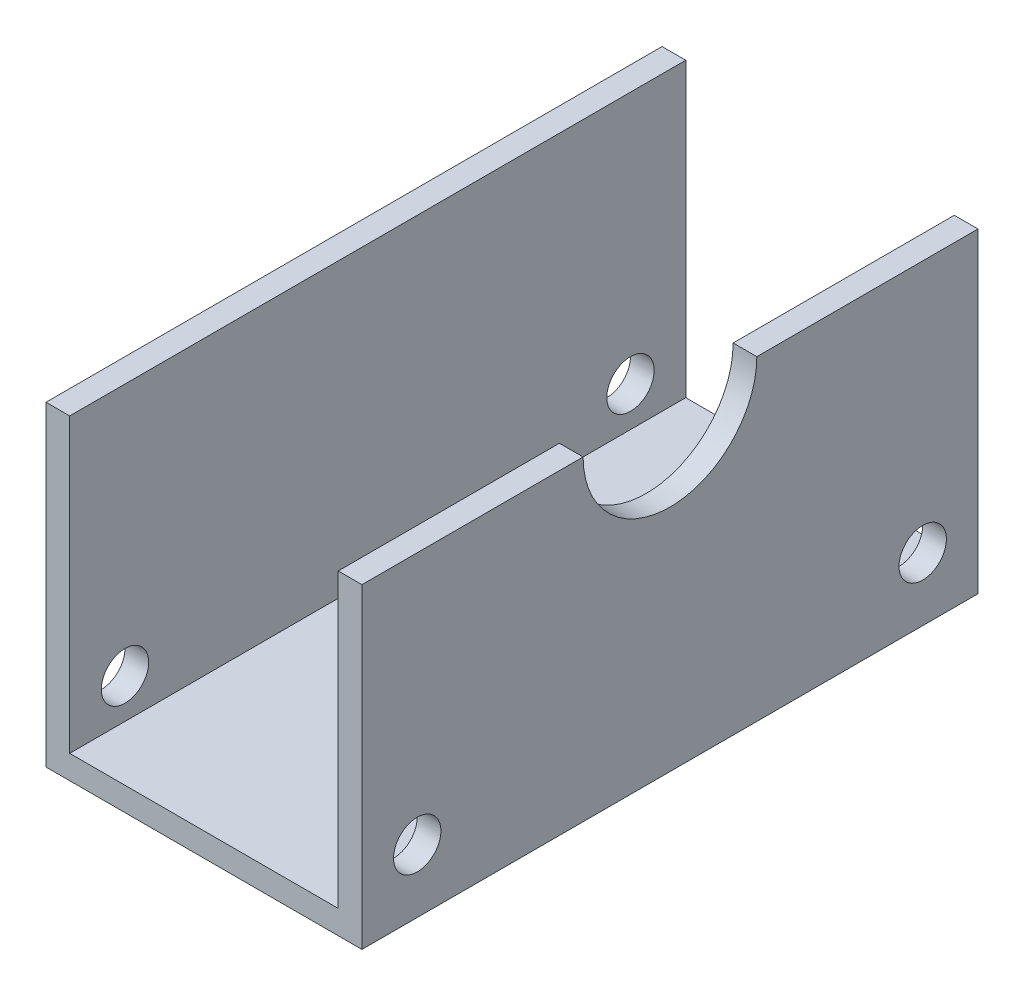
ISO-10303-21;
HEADER;
FILE_DESCRIPTION(('STEP AP214'),'2;1');
FILE_NAME('part.step','',(''),(''),'','','');
FILE_SCHEMA(('AUTOMOTIVE_DESIGN { 1 0 10303 214 1 1 1 1 }'));
ENDSEC;
DATA;
#1=APPLICATION_CONTEXT('core data for automotive mechanical design processes');
#2=APPLICATION_PROTOCOL_DEFINITION('international standard','automotive_design',2000,#1);
#3=PRODUCT_CONTEXT('',#1,'mechanical');
#4=PRODUCT('Part','Part','',(#3));
#5=PRODUCT_RELATED_PRODUCT_CATEGORY('part','',(#4));
#6=PRODUCT_DEFINITION_FORMATION('','',#4);
#7=PRODUCT_DEFINITION_CONTEXT('part definition',#1,'design');
#8=PRODUCT_DEFINITION('design','',#6,#7);
#9=PRODUCT_DEFINITION_SHAPE('','',#8);
#10=(LENGTH_UNIT() NAMED_UNIT(*) SI_UNIT(.MILLI.,.METRE.));
#11=(NAMED_UNIT(*) PLANE_ANGLE_UNIT() SI_UNIT($,.RADIAN.));
#12=(NAMED_UNIT(*) SI_UNIT($,.STERADIAN.) SOLID_ANGLE_UNIT());
#13=UNCERTAINTY_MEASURE_WITH_UNIT(LENGTH_MEASURE(1.E-05),#10,'distance_accuracy_value','');
#14=(GEOMETRIC_REPRESENTATION_CONTEXT(3) GLOBAL_UNCERTAINTY_ASSIGNED_CONTEXT((#13)) GLOBAL_UNIT_ASSIGNED_CONTEXT((#10,
#11,#12)) REPRESENTATION_CONTEXT('',''));
#15=CARTESIAN_POINT('',(0.,0.,0.));
#16=DIRECTION('',(0.,0.,1.));
#17=DIRECTION('',(1.,0.,0.));
#18=AXIS2_PLACEMENT_3D('',#15,#16,#17);
#19=CARTESIAN_POINT('',(3.36373467279582,16.5902105263158,39.));
#20=DIRECTION('',(0.,-1.,0.));
#21=DIRECTION('',(0.,0.,-1.));
#22=AXIS2_PLACEMENT_3D('',#19,#20,#21);
#23=PLANE('',#22);
#24=DIRECTION('',(0.,0.,-1.));
#25=VECTOR('',#24,1.);
#26=CARTESIAN_POINT('',(1.86373467279582,16.5902105263158,39.));
#27=LINE('',#26,#25);
#28=CARTESIAN_POINT('',(1.86373467279582,16.5902105263158,14.));
#29=VERTEX_POINT('',#28);
#30=CARTESIAN_POINT('',(1.86373467279582,16.5902105263158,0.));
#31=VERTEX_POINT('',#30);
#32=EDGE_CURVE('E132',#29,#31,#27,.T.);
#33=ORIENTED_EDGE('',*,*,#32,.F.);
#34=DIRECTION('',(1.,0.,0.));
#35=VECTOR('',#34,1.);
#36=CARTESIAN_POINT('',(-6.63626532720418,16.5902105263158,14.));
#37=LINE('',#36,#35);
#38=CARTESIAN_POINT('',(3.36373467279582,16.5902105263158,14.));
#39=VERTEX_POINT('',#38);
#40=EDGE_CURVE('E48',#29,#39,#37,.T.);
#41=ORIENTED_EDGE('',*,*,#40,.T.);
#42=DIRECTION('',(0.,0.,-1.));
#43=VECTOR('',#42,1.);
#44=CARTESIAN_POINT('',(3.36373467279582,16.5902105263158,39.));
#45=LINE('',#44,#43);
#46=CARTESIAN_POINT('',(3.36373467279582,16.5902105263158,0.));
#47=VERTEX_POINT('',#46);
#48=EDGE_CURVE('E163',#39,#47,#45,.T.);
#49=ORIENTED_EDGE('',*,*,#48,.T.);
#50=DIRECTION('',(-1.,0.,0.));
#51=VECTOR('',#50,1.);
#52=CARTESIAN_POINT('',(3.36373467279582,16.5902105263158,0.));
#53=LINE('',#52,#51);
#54=EDGE_CURVE('E151',#47,#31,#53,.T.);
#55=ORIENTED_EDGE('',*,*,#54,.T.);
#56=EDGE_LOOP('',(#33,#41,#49,#55));
#57=FACE_BOUND('',#56,.T.);
#58=ADVANCED_FACE('F31',(#57),#23,.F.);
#59=CARTESIAN_POINT('',(-15.1362653272042,16.5902105263158,39.));
#60=DIRECTION('',(0.,-1.,0.));
#61=DIRECTION('',(0.,0.,-1.));
#62=AXIS2_PLACEMENT_3D('',#59,#60,#61);
#63=PLANE('',#62);
#64=DIRECTION('',(-1.,0.,0.));
#65=VECTOR('',#64,1.);
#66=CARTESIAN_POINT('',(-15.1362653272042,16.5902105263158,0.));
#67=LINE('',#66,#65);
#68=CARTESIAN_POINT('',(-15.1362653272042,16.5902105263158,0.));
#69=VERTEX_POINT('',#68);
#70=CARTESIAN_POINT('',(-16.6362653272042,16.5902105263158,0.));
#71=VERTEX_POINT('',#70);
#72=EDGE_CURVE('E141',#69,#71,#67,.T.);
#73=ORIENTED_EDGE('',*,*,#72,.T.);
#74=DIRECTION('',(0.,0.,-1.));
#75=VECTOR('',#74,1.);
#76=CARTESIAN_POINT('',(-16.6362653272042,16.5902105263158,39.));
#77=LINE('',#76,#75);
#78=CARTESIAN_POINT('',(-16.6362653272042,16.5902105263158,39.));
#79=VERTEX_POINT('',#78);
#80=EDGE_CURVE('E40',#79,#71,#77,.T.);
#81=ORIENTED_EDGE('',*,*,#80,.F.);
#82=DIRECTION('',(-1.,0.,0.));
#83=VECTOR('',#82,1.);
#84=CARTESIAN_POINT('',(-15.1362653272042,16.5902105263158,39.));
#85=LINE('',#84,#83);
#86=CARTESIAN_POINT('',(-15.1362653272042,16.5902105263158,39.));
#87=VERTEX_POINT('',#86);
#88=EDGE_CURVE('E158',#87,#79,#85,.T.);
#89=ORIENTED_EDGE('',*,*,#88,.F.);
#90=DIRECTION('',(0.,0.,-1.));
#91=VECTOR('',#90,1.);
#92=CARTESIAN_POINT('',(-15.1362653272042,16.5902105263158,39.));
#93=LINE('',#92,#91);
#94=EDGE_CURVE('E137',#87,#69,#93,.T.);
#95=ORIENTED_EDGE('',*,*,#94,.T.);
#96=EDGE_LOOP('',(#73,#81,#89,#95));
#97=FACE_BOUND('',#96,.T.);
#98=ADVANCED_FACE('F33',(#97),#63,.F.);
#99=CARTESIAN_POINT('',(-16.6362653272042,16.5902105263158,39.));
#100=DIRECTION('',(1.,0.,0.));
#101=DIRECTION('',(0.,1.,0.));
#102=AXIS2_PLACEMENT_3D('',#99,#100,#101);
#103=PLANE('',#102);
#104=CARTESIAN_POINT('',(-16.6362653272042,0.590210526315792,35.5));
#105=DIRECTION('',(-1.,0.,0.));
#106=DIRECTION('',(0.,-1.,0.));
#107=AXIS2_PLACEMENT_3D('',#104,#105,#106);
#108=CIRCLE('',#107,1.5);
#109=CARTESIAN_POINT('',(-16.6362653272042,-0.909789473684212,35.5));
#110=VERTEX_POINT('',#109);
#111=EDGE_CURVE('E289',#110,#110,#108,.T.);
#112=ORIENTED_EDGE('',*,*,#111,.F.);
#113=EDGE_LOOP('',(#112));
#114=FACE_BOUND('',#113,.T.);
#115=CARTESIAN_POINT('',(-16.6362653272042,0.590210526315792,3.5));
#116=DIRECTION('',(-1.,0.,0.));
#117=DIRECTION('',(0.,-1.,0.));
#118=AXIS2_PLACEMENT_3D('',#115,#116,#117);
#119=CIRCLE('',#118,1.5);
#120=CARTESIAN_POINT('',(-16.6362653272042,-0.909789473684208,3.5));
#121=VERTEX_POINT('',#120);
#122=EDGE_CURVE('E183',#121,#121,#119,.T.);
#123=ORIENTED_EDGE('',*,*,#122,.F.);
#124=EDGE_LOOP('',(#123));
#125=FACE_BOUND('',#124,.T.);
#126=DIRECTION('',(0.,-1.,0.));
#127=VECTOR('',#126,1.);
#128=CARTESIAN_POINT('',(-16.6362653272042,16.5902105263158,0.));
#129=LINE('',#128,#127);
#130=CARTESIAN_POINT('',(-16.6362653272042,-3.40978947368421,0.));
#131=VERTEX_POINT('',#130);
#132=EDGE_CURVE('E144',#71,#131,#129,.T.);
#133=ORIENTED_EDGE('',*,*,#132,.T.);
#134=DIRECTION('',(0.,0.,-1.));
#135=VECTOR('',#134,1.);
#136=CARTESIAN_POINT('',(-16.6362653272042,-3.40978947368421,39.));
#137=LINE('',#136,#135);
#138=CARTESIAN_POINT('',(-16.6362653272042,-3.40978947368421,39.));
#139=VERTEX_POINT('',#138);
#140=EDGE_CURVE('E170',#139,#131,#137,.T.);
#141=ORIENTED_EDGE('',*,*,#140,.F.);
#142=DIRECTION('',(0.,-1.,0.));
#143=VECTOR('',#142,1.);
#144=CARTESIAN_POINT('',(-16.6362653272042,16.5902105263158,39.));
#145=LINE('',#144,#143);
#146=EDGE_CURVE('E98',#79,#139,#145,.T.);
#147=ORIENTED_EDGE('',*,*,#146,.F.);
#148=ORIENTED_EDGE('',*,*,#80,.T.);
#149=EDGE_LOOP('',(#133,#141,#147,#148));
#150=FACE_BOUND('',#149,.T.);
#151=ADVANCED_FACE('F230',(#114,#125,#150),#103,.F.);
#152=CARTESIAN_POINT('',(-16.6362653272042,-3.40978947368421,39.));
#153=DIRECTION('',(0.,1.,0.));
#154=DIRECTION('',(0.,0.,1.));
#155=AXIS2_PLACEMENT_3D('',#152,#153,#154);
#156=PLANE('',#155);
#157=DIRECTION('',(1.,0.,0.));
#158=VECTOR('',#157,1.);
#159=CARTESIAN_POINT('',(-16.6362653272042,-3.40978947368421,0.));
#160=LINE('',#159,#158);
#161=CARTESIAN_POINT('',(3.36373467279582,-3.40978947368421,0.));
#162=VERTEX_POINT('',#161);
#163=EDGE_CURVE('E146',#131,#162,#160,.T.);
#164=ORIENTED_EDGE('',*,*,#163,.T.);
#165=DIRECTION('',(0.,0.,-1.));
#166=VECTOR('',#165,1.);
#167=CARTESIAN_POINT('',(3.36373467279582,-3.40978947368421,39.));
#168=LINE('',#167,#166);
#169=CARTESIAN_POINT('',(3.36373467279582,-3.40978947368421,39.));
#170=VERTEX_POINT('',#169);
#171=EDGE_CURVE('E167',#170,#162,#168,.T.);
#172=ORIENTED_EDGE('',*,*,#171,.F.);
#173=DIRECTION('',(1.,0.,0.));
#174=VECTOR('',#173,1.);
#175=CARTESIAN_POINT('',(-16.6362653272042,-3.40978947368421,39.));
#176=LINE('',#175,#174);
#177=EDGE_CURVE('E200',#139,#170,#176,.T.);
#178=ORIENTED_EDGE('',*,*,#177,.F.);
#179=ORIENTED_EDGE('',*,*,#140,.T.);
#180=EDGE_LOOP('',(#164,#172,#178,#179));
#181=FACE_BOUND('',#180,.T.);
#182=ADVANCED_FACE('F232',(#181),#156,.F.);
#183=CARTESIAN_POINT('',(3.36373467279582,-3.40978947368421,39.));
#184=DIRECTION('',(-1.,0.,0.));
#185=DIRECTION('',(0.,0.,1.));
#186=AXIS2_PLACEMENT_3D('',#183,#184,#185);
#187=PLANE('',#186);
#188=CARTESIAN_POINT('',(3.36373467279582,0.590210526315798,35.5));
#189=DIRECTION('',(-1.,0.,0.));
#190=DIRECTION('',(0.,-1.,0.));
#191=AXIS2_PLACEMENT_3D('',#188,#189,#190);
#192=CIRCLE('',#191,1.5);
#193=CARTESIAN_POINT('',(3.36373467279582,-0.909789473684205,35.5));
#194=VERTEX_POINT('',#193);
#195=EDGE_CURVE('E285',#194,#194,#192,.T.);
#196=ORIENTED_EDGE('',*,*,#195,.T.);
#197=EDGE_LOOP('',(#196));
#198=FACE_BOUND('',#197,.T.);
#199=CARTESIAN_POINT('',(3.36373467279582,0.590210526315798,3.5));
#200=DIRECTION('',(-1.,0.,0.));
#201=DIRECTION('',(0.,-1.,0.));
#202=AXIS2_PLACEMENT_3D('',#199,#200,#201);
#203=CIRCLE('',#202,1.5);
#204=CARTESIAN_POINT('',(3.36373467279582,-0.909789473684201,3.5));
#205=VERTEX_POINT('',#204);
#206=EDGE_CURVE('E176',#205,#205,#203,.T.);
#207=ORIENTED_EDGE('',*,*,#206,.T.);
#208=EDGE_LOOP('',(#207));
#209=FACE_BOUND('',#208,.T.);
#210=ORIENTED_EDGE('',*,*,#48,.F.);
#211=CARTESIAN_POINT('',(3.36373467279582,16.5902105263158,19.5));
#212=DIRECTION('',(1.,0.,0.));
#213=DIRECTION('',(0.,0.,-1.));
#214=AXIS2_PLACEMENT_3D('',#211,#212,#213);
#215=CIRCLE('',#214,5.5);
#216=CARTESIAN_POINT('',(3.36373467279582,16.5902105263158,25.));
#217=VERTEX_POINT('',#216);
#218=EDGE_CURVE('E180',#217,#39,#215,.T.);
#219=ORIENTED_EDGE('',*,*,#218,.F.);
#220=CARTESIAN_POINT('',(3.36373467279582,16.5902105263158,39.));
#221=VERTEX_POINT('',#220);
#222=EDGE_CURVE('E164',#221,#217,#45,.T.);
#223=ORIENTED_EDGE('',*,*,#222,.F.);
#224=DIRECTION('',(0.,1.,0.));
#225=VECTOR('',#224,1.);
#226=CARTESIAN_POINT('',(3.36373467279582,-3.40978947368421,39.));
#227=LINE('',#226,#225);
#228=EDGE_CURVE('E202',#170,#221,#227,.T.);
#229=ORIENTED_EDGE('',*,*,#228,.F.);
#230=ORIENTED_EDGE('',*,*,#171,.T.);
#231=DIRECTION('',(0.,1.,0.));
#232=VECTOR('',#231,1.);
#233=CARTESIAN_POINT('',(3.36373467279582,-3.40978947368421,0.));
#234=LINE('',#233,#232);
#235=EDGE_CURVE('E148',#162,#47,#234,.T.);
#236=ORIENTED_EDGE('',*,*,#235,.T.);
#237=EDGE_LOOP('',(#210,#219,#223,#229,#230,#236));
#238=FACE_BOUND('',#237,.T.);
#239=ADVANCED_FACE('F210',(#198,#209,#238),#187,.F.);
#240=ORIENTED_EDGE('',*,*,#222,.T.);
#241=DIRECTION('',(1.,0.,0.));
#242=VECTOR('',#241,1.);
#243=CARTESIAN_POINT('',(-6.63626532720418,16.5902105263158,25.));
#244=LINE('',#243,#242);
#245=CARTESIAN_POINT('',(1.86373467279582,16.5902105263158,25.));
#246=VERTEX_POINT('',#245);
#247=EDGE_CURVE('E194',#217,#246,#244,.F.);
#248=ORIENTED_EDGE('',*,*,#247,.T.);
#249=CARTESIAN_POINT('',(1.86373467279582,16.5902105263158,39.));
#250=VERTEX_POINT('',#249);
#251=EDGE_CURVE('E161',#250,#246,#27,.T.);
#252=ORIENTED_EDGE('',*,*,#251,.F.);
#253=DIRECTION('',(-1.,0.,0.));
#254=VECTOR('',#253,1.);
#255=CARTESIAN_POINT('',(3.36373467279582,16.5902105263158,39.));
#256=LINE('',#255,#254);
#257=EDGE_CURVE('E120',#221,#250,#256,.T.);
#258=ORIENTED_EDGE('',*,*,#257,.F.);
#259=EDGE_LOOP('',(#240,#248,#252,#258));
#260=FACE_BOUND('',#259,.T.);
#261=ADVANCED_FACE('F213',(#260),#23,.F.);
#262=CARTESIAN_POINT('',(1.86373467279582,16.5902105263158,39.));
#263=DIRECTION('',(1.,0.,0.));
#264=DIRECTION('',(0.,0.,-1.));
#265=AXIS2_PLACEMENT_3D('',#262,#263,#264);
#266=PLANE('',#265);
#267=CARTESIAN_POINT('',(1.86373467279582,0.590210526315798,35.5));
#268=DIRECTION('',(1.,0.,0.));
#269=DIRECTION('',(0.,0.,-1.));
#270=AXIS2_PLACEMENT_3D('',#267,#268,#269);
#271=CIRCLE('',#270,1.5);
#272=CARTESIAN_POINT('',(1.86373467279582,-0.909789473684206,35.5));
#273=VERTEX_POINT('',#272);
#274=EDGE_CURVE('E188',#273,#273,#271,.T.);
#275=ORIENTED_EDGE('',*,*,#274,.T.);
#276=EDGE_LOOP('',(#275));
#277=FACE_BOUND('',#276,.T.);
#278=CARTESIAN_POINT('',(1.86373467279582,0.590210526315798,3.5));
#279=DIRECTION('',(1.,0.,0.));
#280=DIRECTION('',(0.,0.,-1.));
#281=AXIS2_PLACEMENT_3D('',#278,#279,#280);
#282=CIRCLE('',#281,1.5);
#283=CARTESIAN_POINT('',(1.86373467279582,-0.909789473684201,3.5));
#284=VERTEX_POINT('',#283);
#285=EDGE_CURVE('E175',#284,#284,#282,.T.);
#286=ORIENTED_EDGE('',*,*,#285,.T.);
#287=EDGE_LOOP('',(#286));
#288=FACE_BOUND('',#287,.T.);
#289=ORIENTED_EDGE('',*,*,#251,.T.);
#290=CARTESIAN_POINT('',(1.86373467279582,16.5902105263158,19.5));
#291=DIRECTION('',(1.,0.,0.));
#292=DIRECTION('',(0.,0.,-1.));
#293=AXIS2_PLACEMENT_3D('',#290,#291,#292);
#294=CIRCLE('',#293,5.5);
#295=EDGE_CURVE('E11',#246,#29,#294,.T.);
#296=ORIENTED_EDGE('',*,*,#295,.T.);
#297=ORIENTED_EDGE('',*,*,#32,.T.);
#298=DIRECTION('',(0.,-1.,0.));
#299=VECTOR('',#298,1.);
#300=CARTESIAN_POINT('',(1.86373467279582,16.5902105263158,0.));
#301=LINE('',#300,#299);
#302=CARTESIAN_POINT('',(1.86373467279582,-1.90978947368421,0.));
#303=VERTEX_POINT('',#302);
#304=EDGE_CURVE('E129',#31,#303,#301,.T.);
#305=ORIENTED_EDGE('',*,*,#304,.T.);
#306=DIRECTION('',(0.,0.,-1.));
#307=VECTOR('',#306,1.);
#308=CARTESIAN_POINT('',(1.86373467279582,-1.90978947368421,39.));
#309=LINE('',#308,#307);
#310=CARTESIAN_POINT('',(1.86373467279582,-1.90978947368421,39.));
#311=VERTEX_POINT('',#310);
#312=EDGE_CURVE('E126',#311,#303,#309,.T.);
#313=ORIENTED_EDGE('',*,*,#312,.F.);
#314=DIRECTION('',(0.,-1.,0.));
#315=VECTOR('',#314,1.);
#316=CARTESIAN_POINT('',(1.86373467279582,16.5902105263158,39.));
#317=LINE('',#316,#315);
#318=EDGE_CURVE('E113',#250,#311,#317,.T.);
#319=ORIENTED_EDGE('',*,*,#318,.F.);
#320=EDGE_LOOP('',(#289,#296,#297,#305,#313,#319));
#321=FACE_BOUND('',#320,.T.);
#322=ADVANCED_FACE('F127',(#277,#288,#321),#266,.F.);
#323=CARTESIAN_POINT('',(1.86373467279582,-1.90978947368421,39.));
#324=DIRECTION('',(0.,-1.,0.));
#325=DIRECTION('',(1.,0.,0.));
#326=AXIS2_PLACEMENT_3D('',#323,#324,#325);
#327=PLANE('',#326);
#328=DIRECTION('',(-1.,0.,0.));
#329=VECTOR('',#328,1.);
#330=CARTESIAN_POINT('',(1.86373467279582,-1.90978947368421,0.));
#331=LINE('',#330,#329);
#332=CARTESIAN_POINT('',(-15.1362653272042,-1.90978947368421,0.));
#333=VERTEX_POINT('',#332);
#334=EDGE_CURVE('E155',#303,#333,#331,.T.);
#335=ORIENTED_EDGE('',*,*,#334,.T.);
#336=DIRECTION('',(0.,0.,-1.));
#337=VECTOR('',#336,1.);
#338=CARTESIAN_POINT('',(-15.1362653272042,-1.90978947368421,39.));
#339=LINE('',#338,#337);
#340=CARTESIAN_POINT('',(-15.1362653272042,-1.90978947368421,39.));
#341=VERTEX_POINT('',#340);
#342=EDGE_CURVE('E133',#341,#333,#339,.T.);
#343=ORIENTED_EDGE('',*,*,#342,.F.);
#344=DIRECTION('',(-1.,0.,0.));
#345=VECTOR('',#344,1.);
#346=CARTESIAN_POINT('',(1.86373467279582,-1.90978947368421,39.));
#347=LINE('',#346,#345);
#348=EDGE_CURVE('E117',#311,#341,#347,.T.);
#349=ORIENTED_EDGE('',*,*,#348,.F.);
#350=ORIENTED_EDGE('',*,*,#312,.T.);
#351=EDGE_LOOP('',(#335,#343,#349,#350));
#352=FACE_BOUND('',#351,.T.);
#353=ADVANCED_FACE('F135',(#352),#327,.F.);
#354=CARTESIAN_POINT('',(-15.1362653272042,-1.90978947368421,39.));
#355=DIRECTION('',(-1.,0.,0.));
#356=DIRECTION('',(0.,-1.,0.));
#357=AXIS2_PLACEMENT_3D('',#354,#355,#356);
#358=PLANE('',#357);
#359=CARTESIAN_POINT('',(-15.1362653272042,0.590210526315792,35.5));
#360=DIRECTION('',(-1.,0.,0.));
#361=DIRECTION('',(0.,-1.,0.));
#362=AXIS2_PLACEMENT_3D('',#359,#360,#361);
#363=CIRCLE('',#362,1.5);
#364=CARTESIAN_POINT('',(-15.1362653272042,-0.909789473684212,35.5));
#365=VERTEX_POINT('',#364);
#366=EDGE_CURVE('E35',#365,#365,#363,.T.);
#367=ORIENTED_EDGE('',*,*,#366,.T.);
#368=EDGE_LOOP('',(#367));
#369=FACE_BOUND('',#368,.T.);
#370=CARTESIAN_POINT('',(-15.1362653272042,0.590210526315792,3.5));
#371=DIRECTION('',(-1.,0.,0.));
#372=DIRECTION('',(0.,-1.,0.));
#373=AXIS2_PLACEMENT_3D('',#370,#371,#372);
#374=CIRCLE('',#373,1.5);
#375=CARTESIAN_POINT('',(-15.1362653272042,-0.909789473684207,3.5));
#376=VERTEX_POINT('',#375);
#377=EDGE_CURVE('E173',#376,#376,#374,.T.);
#378=ORIENTED_EDGE('',*,*,#377,.T.);
#379=EDGE_LOOP('',(#378));
#380=FACE_BOUND('',#379,.T.);
#381=DIRECTION('',(0.,1.,0.));
#382=VECTOR('',#381,1.);
#383=CARTESIAN_POINT('',(-15.1362653272042,-1.90978947368421,0.));
#384=LINE('',#383,#382);
#385=EDGE_CURVE('E89',#333,#69,#384,.T.);
#386=ORIENTED_EDGE('',*,*,#385,.T.);
#387=ORIENTED_EDGE('',*,*,#94,.F.);
#388=DIRECTION('',(0.,1.,0.));
#389=VECTOR('',#388,1.);
#390=CARTESIAN_POINT('',(-15.1362653272042,-1.90978947368421,39.));
#391=LINE('',#390,#389);
#392=EDGE_CURVE('E56',#341,#87,#391,.T.);
#393=ORIENTED_EDGE('',*,*,#392,.F.);
#394=ORIENTED_EDGE('',*,*,#342,.T.);
#395=EDGE_LOOP('',(#386,#387,#393,#394));
#396=FACE_BOUND('',#395,.T.);
#397=ADVANCED_FACE('F226',(#369,#380,#396),#358,.F.);
#398=CARTESIAN_POINT('',(-16.6362653272042,16.5902105263158,39.));
#399=DIRECTION('',(0.,0.,1.));
#400=DIRECTION('',(1.,0.,0.));
#401=AXIS2_PLACEMENT_3D('',#398,#399,#400);
#402=PLANE('',#401);
#403=ORIENTED_EDGE('',*,*,#88,.T.);
#404=ORIENTED_EDGE('',*,*,#146,.T.);
#405=ORIENTED_EDGE('',*,*,#177,.T.);
#406=ORIENTED_EDGE('',*,*,#228,.T.);
#407=ORIENTED_EDGE('',*,*,#257,.T.);
#408=ORIENTED_EDGE('',*,*,#318,.T.);
#409=ORIENTED_EDGE('',*,*,#348,.T.);
#410=ORIENTED_EDGE('',*,*,#392,.T.);
#411=EDGE_LOOP('',(#403,#404,#405,#406,#407,#408,#409,#410));
#412=FACE_BOUND('',#411,.T.);
#413=ADVANCED_FACE('F115',(#412),#402,.T.);
#414=CARTESIAN_POINT('',(-16.6362653272042,16.5902105263158,0.));
#415=DIRECTION('',(0.,0.,1.));
#416=DIRECTION('',(1.,0.,0.));
#417=AXIS2_PLACEMENT_3D('',#414,#415,#416);
#418=PLANE('',#417);
#419=ORIENTED_EDGE('',*,*,#72,.F.);
#420=ORIENTED_EDGE('',*,*,#385,.F.);
#421=ORIENTED_EDGE('',*,*,#334,.F.);
#422=ORIENTED_EDGE('',*,*,#304,.F.);
#423=ORIENTED_EDGE('',*,*,#54,.F.);
#424=ORIENTED_EDGE('',*,*,#235,.F.);
#425=ORIENTED_EDGE('',*,*,#163,.F.);
#426=ORIENTED_EDGE('',*,*,#132,.F.);
#427=EDGE_LOOP('',(#419,#420,#421,#422,#423,#424,#425,#426));
#428=FACE_BOUND('',#427,.T.);
#429=ADVANCED_FACE('F225',(#428),#418,.F.);
#430=CARTESIAN_POINT('',(-6.63626532720418,16.5902105263158,19.5));
#431=DIRECTION('',(1.,0.,0.));
#432=DIRECTION('',(0.,0.,-1.));
#433=AXIS2_PLACEMENT_3D('',#430,#431,#432);
#434=CYLINDRICAL_SURFACE('',#433,5.5);
#435=ORIENTED_EDGE('',*,*,#295,.F.);
#436=ORIENTED_EDGE('',*,*,#247,.F.);
#437=ORIENTED_EDGE('',*,*,#218,.T.);
#438=ORIENTED_EDGE('',*,*,#40,.F.);
#439=EDGE_LOOP('',(#435,#436,#437,#438));
#440=FACE_BOUND('',#439,.T.);
#441=ADVANCED_FACE('F218',(#440),#434,.F.);
#442=CARTESIAN_POINT('',(3.36373467279582,0.590210526315798,3.5));
#443=DIRECTION('',(-1.,0.,0.));
#444=DIRECTION('',(0.,-1.,0.));
#445=AXIS2_PLACEMENT_3D('',#442,#443,#444);
#446=CYLINDRICAL_SURFACE('',#445,1.5);
#447=CARTESIAN_POINT('',(-16.6362653272042,-0.909789473684208,3.5));
#448=CARTESIAN_POINT('',(-16.6206403272042,-0.909789473684208,3.5));
#449=CARTESIAN_POINT('',(-16.6050153272042,-0.909789473684208,3.5));
#450=CARTESIAN_POINT('',(-16.5737653272042,-0.909789473684208,3.5));
#451=CARTESIAN_POINT('',(-16.5581403272042,-0.909789473684208,3.5));
#452=CARTESIAN_POINT('',(-16.5268903272042,-0.909789473684208,3.5));
#453=CARTESIAN_POINT('',(-16.5112653272042,-0.909789473684208,3.5));
#454=CARTESIAN_POINT('',(-16.4800153272042,-0.909789473684208,3.5));
#455=CARTESIAN_POINT('',(-16.4643903272042,-0.909789473684208,3.5));
#456=CARTESIAN_POINT('',(-16.4331403272042,-0.909789473684208,3.5));
#457=CARTESIAN_POINT('',(-16.4175153272042,-0.909789473684208,3.5));
#458=CARTESIAN_POINT('',(-16.3862653272042,-0.909789473684208,3.5));
#459=CARTESIAN_POINT('',(-16.3706403272042,-0.909789473684208,3.5));
#460=CARTESIAN_POINT('',(-16.3393903272042,-0.909789473684208,3.5));
#461=CARTESIAN_POINT('',(-16.3237653272042,-0.909789473684208,3.5));
#462=CARTESIAN_POINT('',(-16.2925153272042,-0.909789473684208,3.5));
#463=CARTESIAN_POINT('',(-16.2768903272042,-0.909789473684208,3.5));
#464=CARTESIAN_POINT('',(-16.2456403272042,-0.909789473684208,3.5));
#465=CARTESIAN_POINT('',(-16.2300153272042,-0.909789473684208,3.5));
#466=CARTESIAN_POINT('',(-16.1987653272042,-0.909789473684208,3.5));
#467=CARTESIAN_POINT('',(-16.1831403272042,-0.909789473684208,3.5));
#468=CARTESIAN_POINT('',(-16.1518903272042,-0.909789473684208,3.5));
#469=CARTESIAN_POINT('',(-16.1362653272042,-0.909789473684207,3.5));
#470=CARTESIAN_POINT('',(-16.1050153272042,-0.909789473684207,3.5));
#471=CARTESIAN_POINT('',(-16.0893903272042,-0.909789473684207,3.5));
#472=CARTESIAN_POINT('',(-16.0581403272042,-0.909789473684207,3.5));
#473=CARTESIAN_POINT('',(-16.0425153272042,-0.909789473684207,3.5));
#474=CARTESIAN_POINT('',(-16.0112653272042,-0.909789473684207,3.5));
#475=CARTESIAN_POINT('',(-15.9956403272042,-0.909789473684207,3.5));
#476=CARTESIAN_POINT('',(-15.9643903272042,-0.909789473684207,3.5));
#477=CARTESIAN_POINT('',(-15.9487653272042,-0.909789473684207,3.5));
#478=CARTESIAN_POINT('',(-15.9175153272042,-0.909789473684207,3.5));
#479=CARTESIAN_POINT('',(-15.9018903272042,-0.909789473684207,3.5));
#480=CARTESIAN_POINT('',(-15.8706403272042,-0.909789473684207,3.5));
#481=CARTESIAN_POINT('',(-15.8550153272042,-0.909789473684207,3.5));
#482=CARTESIAN_POINT('',(-15.8237653272042,-0.909789473684207,3.5));
#483=CARTESIAN_POINT('',(-15.8081403272042,-0.909789473684207,3.5));
#484=CARTESIAN_POINT('',(-15.7768903272042,-0.909789473684207,3.5));
#485=CARTESIAN_POINT('',(-15.7612653272042,-0.909789473684207,3.5));
#486=CARTESIAN_POINT('',(-15.7300153272042,-0.909789473684207,3.5));
#487=CARTESIAN_POINT('',(-15.7143903272042,-0.909789473684207,3.5));
#488=CARTESIAN_POINT('',(-15.6831403272042,-0.909789473684207,3.5));
#489=CARTESIAN_POINT('',(-15.6675153272042,-0.909789473684207,3.5));
#490=CARTESIAN_POINT('',(-15.6362653272042,-0.909789473684207,3.5));
#491=CARTESIAN_POINT('',(-15.6206403272042,-0.909789473684207,3.5));
#492=CARTESIAN_POINT('',(-15.5893903272042,-0.909789473684207,3.5));
#493=CARTESIAN_POINT('',(-15.5737653272042,-0.909789473684207,3.5));
#494=CARTESIAN_POINT('',(-15.5425153272042,-0.909789473684207,3.5));
#495=CARTESIAN_POINT('',(-15.5268903272042,-0.909789473684207,3.5));
#496=CARTESIAN_POINT('',(-15.4956403272042,-0.909789473684207,3.5));
#497=CARTESIAN_POINT('',(-15.4800153272042,-0.909789473684207,3.5));
#498=CARTESIAN_POINT('',(-15.4487653272042,-0.909789473684207,3.5));
#499=CARTESIAN_POINT('',(-15.4331403272042,-0.909789473684207,3.5));
#500=CARTESIAN_POINT('',(-15.4018903272042,-0.909789473684207,3.5));
#501=CARTESIAN_POINT('',(-15.3862653272042,-0.909789473684207,3.5));
#502=CARTESIAN_POINT('',(-15.3550153272042,-0.909789473684207,3.5));
#503=CARTESIAN_POINT('',(-15.3393903272042,-0.909789473684207,3.5));
#504=CARTESIAN_POINT('',(-15.3081403272042,-0.909789473684207,3.5));
#505=CARTESIAN_POINT('',(-15.2925153272042,-0.909789473684207,3.5));
#506=CARTESIAN_POINT('',(-15.2612653272042,-0.909789473684207,3.5));
#507=CARTESIAN_POINT('',(-15.2456403272042,-0.909789473684207,3.5));
#508=CARTESIAN_POINT('',(-15.2143903272042,-0.909789473684207,3.5));
#509=CARTESIAN_POINT('',(-15.1987653272042,-0.909789473684207,3.5));
#510=CARTESIAN_POINT('',(-15.1675153272042,-0.909789473684207,3.5));
#511=CARTESIAN_POINT('',(-15.1518903272042,-0.909789473684207,3.5));
#512=CARTESIAN_POINT('',(-15.1362653272042,-0.909789473684207,3.5));
#513=B_SPLINE_CURVE_WITH_KNOTS('',3,(#447,#448,#449,#450,#451,#452,#453,#454,#455,#456,#457,
#458,#459,#460,#461,#462,#463,#464,#465,#466,#467,#468,#469,#470,#471,#472,#473,#474,#475,#476,
#477,#478,#479,#480,#481,#482,#483,#484,#485,#486,#487,#488,#489,#490,#491,#492,#493,#494,#495,
#496,#497,#498,#499,#500,#501,#502,#503,#504,#505,#506,#507,#508,#509,#510,#511,#512),
.UNSPECIFIED.,.F.,.F.,(4,2,2,2,2,2,2,2,2,2,2,2,2,2,2,2,2,2,2,2,2,2,2,2,2,2,2,2,2,2,2,2,4),(0.,
0.0468749999999983,0.0937500000000001,0.140624999999998,0.1875,0.234374999999998,0.28125,
0.328124999999999,0.375,0.421874999999999,0.468749999999997,0.515624999999999,0.562499999999997,
0.609374999999999,0.656249999999997,0.703124999999999,0.749999999999997,0.796874999999996,
0.843749999999997,0.890624999999996,0.937499999999997,0.984374999999996,1.03125,1.078125,
1.12499999999999,1.171875,1.21874999999999,1.265625,1.31249999999999,1.359375,1.40624999999999,
1.453125,1.49999999999999),.UNSPECIFIED.);
#514=EDGE_CURVE('BSEAM269',#121,#376,#513,.T.);
#515=ORIENTED_EDGE('',*,*,#122,.T.);
#516=ORIENTED_EDGE('',*,*,#377,.F.);
#517=ORIENTED_EDGE('',*,*,#514,.T.);
#518=ORIENTED_EDGE('',*,*,#514,.F.);
#519=EDGE_LOOP('',(#515,#517,#516,#518));
#520=FACE_BOUND('',#519,.T.);
#521=ADVANCED_FACE('F269',(#520),#446,.F.);
#522=CARTESIAN_POINT('',(3.36373467279582,-0.909789473684201,3.5));
#523=CARTESIAN_POINT('',(3.34810967279582,-0.909789473684201,3.5));
#524=CARTESIAN_POINT('',(3.33248467279582,-0.909789473684201,3.5));
#525=CARTESIAN_POINT('',(3.30123467279582,-0.909789473684201,3.5));
#526=CARTESIAN_POINT('',(3.28560967279582,-0.909789473684201,3.5));
#527=CARTESIAN_POINT('',(3.25435967279582,-0.909789473684201,3.5));
#528=CARTESIAN_POINT('',(3.23873467279582,-0.909789473684201,3.5));
#529=CARTESIAN_POINT('',(3.20748467279582,-0.909789473684201,3.5));
#530=CARTESIAN_POINT('',(3.19185967279582,-0.909789473684201,3.5));
#531=CARTESIAN_POINT('',(3.16060967279582,-0.909789473684201,3.5));
#532=CARTESIAN_POINT('',(3.14498467279582,-0.909789473684201,3.5));
#533=CARTESIAN_POINT('',(3.11373467279582,-0.909789473684201,3.5));
#534=CARTESIAN_POINT('',(3.09810967279582,-0.909789473684201,3.5));
#535=CARTESIAN_POINT('',(3.06685967279582,-0.909789473684201,3.5));
#536=CARTESIAN_POINT('',(3.05123467279582,-0.909789473684201,3.5));
#537=CARTESIAN_POINT('',(3.01998467279582,-0.909789473684201,3.5));
#538=CARTESIAN_POINT('',(3.00435967279582,-0.909789473684201,3.5));
#539=CARTESIAN_POINT('',(2.97310967279582,-0.909789473684201,3.5));
#540=CARTESIAN_POINT('',(2.95748467279582,-0.909789473684201,3.5));
#541=CARTESIAN_POINT('',(2.92623467279582,-0.909789473684201,3.5));
#542=CARTESIAN_POINT('',(2.91060967279582,-0.909789473684201,3.5));
#543=CARTESIAN_POINT('',(2.87935967279582,-0.909789473684201,3.5));
#544=CARTESIAN_POINT('',(2.86373467279582,-0.909789473684201,3.5));
#545=CARTESIAN_POINT('',(2.83248467279582,-0.909789473684201,3.5));
#546=CARTESIAN_POINT('',(2.81685967279582,-0.909789473684201,3.5));
#547=CARTESIAN_POINT('',(2.78560967279582,-0.909789473684201,3.5));
#548=CARTESIAN_POINT('',(2.76998467279582,-0.909789473684201,3.5));
#549=CARTESIAN_POINT('',(2.73873467279582,-0.909789473684201,3.5));
#550=CARTESIAN_POINT('',(2.72310967279582,-0.909789473684201,3.5));
#551=CARTESIAN_POINT('',(2.69185967279582,-0.909789473684201,3.5));
#552=CARTESIAN_POINT('',(2.67623467279582,-0.909789473684201,3.5));
#553=CARTESIAN_POINT('',(2.64498467279582,-0.909789473684201,3.5));
#554=CARTESIAN_POINT('',(2.62935967279582,-0.909789473684201,3.5));
#555=CARTESIAN_POINT('',(2.59810967279582,-0.909789473684201,3.5));
#556=CARTESIAN_POINT('',(2.58248467279582,-0.909789473684201,3.5));
#557=CARTESIAN_POINT('',(2.55123467279582,-0.909789473684201,3.5));
#558=CARTESIAN_POINT('',(2.53560967279582,-0.909789473684201,3.5));
#559=CARTESIAN_POINT('',(2.50435967279582,-0.909789473684201,3.5));
#560=CARTESIAN_POINT('',(2.48873467279582,-0.909789473684201,3.5));
#561=CARTESIAN_POINT('',(2.45748467279582,-0.909789473684201,3.5));
#562=CARTESIAN_POINT('',(2.44185967279582,-0.909789473684201,3.5));
#563=CARTESIAN_POINT('',(2.41060967279582,-0.909789473684201,3.5));
#564=CARTESIAN_POINT('',(2.39498467279582,-0.909789473684201,3.5));
#565=CARTESIAN_POINT('',(2.36373467279582,-0.909789473684201,3.5));
#566=CARTESIAN_POINT('',(2.34810967279582,-0.909789473684201,3.5));
#567=CARTESIAN_POINT('',(2.31685967279582,-0.909789473684201,3.5));
#568=CARTESIAN_POINT('',(2.30123467279582,-0.909789473684201,3.5));
#569=CARTESIAN_POINT('',(2.26998467279582,-0.909789473684201,3.5));
#570=CARTESIAN_POINT('',(2.25435967279582,-0.909789473684201,3.5));
#571=CARTESIAN_POINT('',(2.22310967279582,-0.909789473684201,3.5));
#572=CARTESIAN_POINT('',(2.20748467279582,-0.909789473684201,3.5));
#573=CARTESIAN_POINT('',(2.17623467279582,-0.909789473684201,3.5));
#574=CARTESIAN_POINT('',(2.16060967279582,-0.909789473684201,3.5));
#575=CARTESIAN_POINT('',(2.12935967279582,-0.909789473684201,3.5));
#576=CARTESIAN_POINT('',(2.11373467279582,-0.909789473684201,3.5));
#577=CARTESIAN_POINT('',(2.08248467279582,-0.909789473684201,3.5));
#578=CARTESIAN_POINT('',(2.06685967279582,-0.909789473684201,3.5));
#579=CARTESIAN_POINT('',(2.03560967279582,-0.909789473684201,3.5));
#580=CARTESIAN_POINT('',(2.01998467279582,-0.909789473684201,3.5));
#581=CARTESIAN_POINT('',(1.98873467279582,-0.909789473684201,3.5));
#582=CARTESIAN_POINT('',(1.97310967279582,-0.909789473684201,3.5));
#583=CARTESIAN_POINT('',(1.94185967279582,-0.909789473684201,3.5));
#584=CARTESIAN_POINT('',(1.92623467279582,-0.909789473684201,3.5));
#585=CARTESIAN_POINT('',(1.89498467279582,-0.909789473684201,3.5));
#586=CARTESIAN_POINT('',(1.87935967279582,-0.909789473684201,3.5));
#587=CARTESIAN_POINT('',(1.86373467279582,-0.909789473684201,3.5));
#588=B_SPLINE_CURVE_WITH_KNOTS('',3,(#522,#523,#524,#525,#526,#527,#528,#529,#530,#531,#532,
#533,#534,#535,#536,#537,#538,#539,#540,#541,#542,#543,#544,#545,#546,#547,#548,#549,#550,#551,
#552,#553,#554,#555,#556,#557,#558,#559,#560,#561,#562,#563,#564,#565,#566,#567,#568,#569,#570,
#571,#572,#573,#574,#575,#576,#577,#578,#579,#580,#581,#582,#583,#584,#585,#586,#587),
.UNSPECIFIED.,.F.,.F.,(4,2,2,2,2,2,2,2,2,2,2,2,2,2,2,2,2,2,2,2,2,2,2,2,2,2,2,2,2,2,2,2,4),(0.,
0.0468750000000005,0.0937500000000005,0.140625000000001,0.187500000000001,0.234375000000001,
0.281250000000002,0.328125000000002,0.375000000000002,0.421875000000002,0.468750000000003,
0.515625000000003,0.562500000000003,0.609375000000003,0.656250000000003,0.703125000000004,
0.750000000000004,0.796875000000004,0.843750000000004,0.890625000000005,0.937500000000005,
0.984375000000005,1.03125000000001,1.07812500000001,1.12500000000001,1.17187500000001,
1.21875000000001,1.26562500000001,1.31250000000001,1.35937500000001,1.40625000000001,
1.45312500000001,1.50000000000001),.UNSPECIFIED.);
#589=EDGE_CURVE('BSEAM270',#205,#284,#588,.T.);
#590=ORIENTED_EDGE('',*,*,#206,.F.);
#591=ORIENTED_EDGE('',*,*,#285,.F.);
#592=ORIENTED_EDGE('',*,*,#589,.T.);
#593=ORIENTED_EDGE('',*,*,#589,.F.);
#594=EDGE_LOOP('',(#590,#592,#591,#593));
#595=FACE_BOUND('',#594,.T.);
#596=ADVANCED_FACE('F270',(#595),#446,.F.);
#597=CARTESIAN_POINT('',(3.36373467279582,0.590210526315798,35.5));
#598=DIRECTION('',(-1.,0.,0.));
#599=DIRECTION('',(0.,-1.,0.));
#600=AXIS2_PLACEMENT_3D('',#597,#598,#599);
#601=CYLINDRICAL_SURFACE('',#600,1.5);
#602=CARTESIAN_POINT('',(-16.6362653272042,-0.909789473684212,35.5));
#603=CARTESIAN_POINT('',(-16.6206403272042,-0.909789473684212,35.5));
#604=CARTESIAN_POINT('',(-16.6050153272042,-0.909789473684212,35.5));
#605=CARTESIAN_POINT('',(-16.5737653272042,-0.909789473684212,35.5));
#606=CARTESIAN_POINT('',(-16.5581403272042,-0.909789473684212,35.5));
#607=CARTESIAN_POINT('',(-16.5268903272042,-0.909789473684212,35.5));
#608=CARTESIAN_POINT('',(-16.5112653272042,-0.909789473684212,35.5));
#609=CARTESIAN_POINT('',(-16.4800153272042,-0.909789473684212,35.5));
#610=CARTESIAN_POINT('',(-16.4643903272042,-0.909789473684212,35.5));
#611=CARTESIAN_POINT('',(-16.4331403272042,-0.909789473684212,35.5));
#612=CARTESIAN_POINT('',(-16.4175153272042,-0.909789473684212,35.5));
#613=CARTESIAN_POINT('',(-16.3862653272042,-0.909789473684212,35.5));
#614=CARTESIAN_POINT('',(-16.3706403272042,-0.909789473684212,35.5));
#615=CARTESIAN_POINT('',(-16.3393903272042,-0.909789473684212,35.5));
#616=CARTESIAN_POINT('',(-16.3237653272042,-0.909789473684212,35.5));
#617=CARTESIAN_POINT('',(-16.2925153272042,-0.909789473684212,35.5));
#618=CARTESIAN_POINT('',(-16.2768903272042,-0.909789473684212,35.5));
#619=CARTESIAN_POINT('',(-16.2456403272042,-0.909789473684212,35.5));
#620=CARTESIAN_POINT('',(-16.2300153272042,-0.909789473684212,35.5));
#621=CARTESIAN_POINT('',(-16.1987653272042,-0.909789473684212,35.5));
#622=CARTESIAN_POINT('',(-16.1831403272042,-0.909789473684212,35.5));
#623=CARTESIAN_POINT('',(-16.1518903272042,-0.909789473684212,35.5));
#624=CARTESIAN_POINT('',(-16.1362653272042,-0.909789473684212,35.5));
#625=CARTESIAN_POINT('',(-16.1050153272042,-0.909789473684212,35.5));
#626=CARTESIAN_POINT('',(-16.0893903272042,-0.909789473684212,35.5));
#627=CARTESIAN_POINT('',(-16.0581403272042,-0.909789473684212,35.5));
#628=CARTESIAN_POINT('',(-16.0425153272042,-0.909789473684212,35.5));
#629=CARTESIAN_POINT('',(-16.0112653272042,-0.909789473684212,35.5));
#630=CARTESIAN_POINT('',(-15.9956403272042,-0.909789473684212,35.5));
#631=CARTESIAN_POINT('',(-15.9643903272042,-0.909789473684212,35.5));
#632=CARTESIAN_POINT('',(-15.9487653272042,-0.909789473684212,35.5));
#633=CARTESIAN_POINT('',(-15.9175153272042,-0.909789473684212,35.5));
#634=CARTESIAN_POINT('',(-15.9018903272042,-0.909789473684212,35.5));
#635=CARTESIAN_POINT('',(-15.8706403272042,-0.909789473684212,35.5));
#636=CARTESIAN_POINT('',(-15.8550153272042,-0.909789473684212,35.5));
#637=CARTESIAN_POINT('',(-15.8237653272042,-0.909789473684212,35.5));
#638=CARTESIAN_POINT('',(-15.8081403272042,-0.909789473684212,35.5));
#639=CARTESIAN_POINT('',(-15.7768903272042,-0.909789473684212,35.5));
#640=CARTESIAN_POINT('',(-15.7612653272042,-0.909789473684212,35.5));
#641=CARTESIAN_POINT('',(-15.7300153272042,-0.909789473684212,35.5));
#642=CARTESIAN_POINT('',(-15.7143903272042,-0.909789473684212,35.5));
#643=CARTESIAN_POINT('',(-15.6831403272042,-0.909789473684212,35.5));
#644=CARTESIAN_POINT('',(-15.6675153272042,-0.909789473684212,35.5));
#645=CARTESIAN_POINT('',(-15.6362653272042,-0.909789473684212,35.5));
#646=CARTESIAN_POINT('',(-15.6206403272042,-0.909789473684212,35.5));
#647=CARTESIAN_POINT('',(-15.5893903272042,-0.909789473684212,35.5));
#648=CARTESIAN_POINT('',(-15.5737653272042,-0.909789473684212,35.5));
#649=CARTESIAN_POINT('',(-15.5425153272042,-0.909789473684212,35.5));
#650=CARTESIAN_POINT('',(-15.5268903272042,-0.909789473684212,35.5));
#651=CARTESIAN_POINT('',(-15.4956403272042,-0.909789473684212,35.5));
#652=CARTESIAN_POINT('',(-15.4800153272042,-0.909789473684212,35.5));
#653=CARTESIAN_POINT('',(-15.4487653272042,-0.909789473684212,35.5));
#654=CARTESIAN_POINT('',(-15.4331403272042,-0.909789473684212,35.5));
#655=CARTESIAN_POINT('',(-15.4018903272042,-0.909789473684212,35.5));
#656=CARTESIAN_POINT('',(-15.3862653272042,-0.909789473684212,35.5));
#657=CARTESIAN_POINT('',(-15.3550153272042,-0.909789473684212,35.5));
#658=CARTESIAN_POINT('',(-15.3393903272042,-0.909789473684212,35.5));
#659=CARTESIAN_POINT('',(-15.3081403272042,-0.909789473684212,35.5));
#660=CARTESIAN_POINT('',(-15.2925153272042,-0.909789473684212,35.5));
#661=CARTESIAN_POINT('',(-15.2612653272042,-0.909789473684212,35.5));
#662=CARTESIAN_POINT('',(-15.2456403272042,-0.909789473684212,35.5));
#663=CARTESIAN_POINT('',(-15.2143903272042,-0.909789473684212,35.5));
#664=CARTESIAN_POINT('',(-15.1987653272042,-0.909789473684212,35.5));
#665=CARTESIAN_POINT('',(-15.1675153272042,-0.909789473684212,35.5));
#666=CARTESIAN_POINT('',(-15.1518903272042,-0.909789473684212,35.5));
#667=CARTESIAN_POINT('',(-15.1362653272042,-0.909789473684212,35.5));
#668=B_SPLINE_CURVE_WITH_KNOTS('',3,(#602,#603,#604,#605,#606,#607,#608,#609,#610,#611,#612,
#613,#614,#615,#616,#617,#618,#619,#620,#621,#622,#623,#624,#625,#626,#627,#628,#629,#630,#631,
#632,#633,#634,#635,#636,#637,#638,#639,#640,#641,#642,#643,#644,#645,#646,#647,#648,#649,#650,
#651,#652,#653,#654,#655,#656,#657,#658,#659,#660,#661,#662,#663,#664,#665,#666,#667),
.UNSPECIFIED.,.F.,.F.,(4,2,2,2,2,2,2,2,2,2,2,2,2,2,2,2,2,2,2,2,2,2,2,2,2,2,2,2,2,2,2,2,4),(0.,
0.0468749999999983,0.0937500000000001,0.140624999999998,0.1875,0.234374999999998,0.28125,
0.328124999999999,0.375,0.421874999999999,0.468749999999997,0.515624999999999,0.562499999999997,
0.609374999999999,0.656249999999997,0.703124999999999,0.749999999999997,0.796874999999996,
0.843749999999997,0.890624999999996,0.937499999999997,0.984374999999996,1.03125,1.078125,
1.12499999999999,1.171875,1.21874999999999,1.265625,1.31249999999999,1.359375,1.40624999999999,
1.453125,1.49999999999999),.UNSPECIFIED.);
#669=EDGE_CURVE('BSEAM273',#110,#365,#668,.T.);
#670=ORIENTED_EDGE('',*,*,#111,.T.);
#671=ORIENTED_EDGE('',*,*,#366,.F.);
#672=ORIENTED_EDGE('',*,*,#669,.T.);
#673=ORIENTED_EDGE('',*,*,#669,.F.);
#674=EDGE_LOOP('',(#670,#672,#671,#673));
#675=FACE_BOUND('',#674,.T.);
#676=ADVANCED_FACE('F273',(#675),#601,.F.);
#677=CARTESIAN_POINT('',(3.36373467279582,-0.909789473684205,35.5));
#678=CARTESIAN_POINT('',(3.34810967279582,-0.909789473684205,35.5));
#679=CARTESIAN_POINT('',(3.33248467279582,-0.909789473684205,35.5));
#680=CARTESIAN_POINT('',(3.30123467279582,-0.909789473684205,35.5));
#681=CARTESIAN_POINT('',(3.28560967279582,-0.909789473684205,35.5));
#682=CARTESIAN_POINT('',(3.25435967279582,-0.909789473684205,35.5));
#683=CARTESIAN_POINT('',(3.23873467279582,-0.909789473684205,35.5));
#684=CARTESIAN_POINT('',(3.20748467279582,-0.909789473684205,35.5));
#685=CARTESIAN_POINT('',(3.19185967279582,-0.909789473684206,35.5));
#686=CARTESIAN_POINT('',(3.16060967279582,-0.909789473684206,35.5));
#687=CARTESIAN_POINT('',(3.14498467279582,-0.909789473684206,35.5));
#688=CARTESIAN_POINT('',(3.11373467279582,-0.909789473684206,35.5));
#689=CARTESIAN_POINT('',(3.09810967279582,-0.909789473684206,35.5));
#690=CARTESIAN_POINT('',(3.06685967279582,-0.909789473684206,35.5));
#691=CARTESIAN_POINT('',(3.05123467279582,-0.909789473684206,35.5));
#692=CARTESIAN_POINT('',(3.01998467279582,-0.909789473684206,35.5));
#693=CARTESIAN_POINT('',(3.00435967279582,-0.909789473684206,35.5));
#694=CARTESIAN_POINT('',(2.97310967279582,-0.909789473684206,35.5));
#695=CARTESIAN_POINT('',(2.95748467279582,-0.909789473684206,35.5));
#696=CARTESIAN_POINT('',(2.92623467279582,-0.909789473684206,35.5));
#697=CARTESIAN_POINT('',(2.91060967279582,-0.909789473684206,35.5));
#698=CARTESIAN_POINT('',(2.87935967279582,-0.909789473684206,35.5));
#699=CARTESIAN_POINT('',(2.86373467279582,-0.909789473684206,35.5));
#700=CARTESIAN_POINT('',(2.83248467279582,-0.909789473684206,35.5));
#701=CARTESIAN_POINT('',(2.81685967279582,-0.909789473684206,35.5));
#702=CARTESIAN_POINT('',(2.78560967279582,-0.909789473684206,35.5));
#703=CARTESIAN_POINT('',(2.76998467279582,-0.909789473684206,35.5));
#704=CARTESIAN_POINT('',(2.73873467279582,-0.909789473684206,35.5));
#705=CARTESIAN_POINT('',(2.72310967279582,-0.909789473684206,35.5));
#706=CARTESIAN_POINT('',(2.69185967279582,-0.909789473684206,35.5));
#707=CARTESIAN_POINT('',(2.67623467279582,-0.909789473684206,35.5));
#708=CARTESIAN_POINT('',(2.64498467279582,-0.909789473684206,35.5));
#709=CARTESIAN_POINT('',(2.62935967279582,-0.909789473684206,35.5));
#710=CARTESIAN_POINT('',(2.59810967279582,-0.909789473684206,35.5));
#711=CARTESIAN_POINT('',(2.58248467279582,-0.909789473684206,35.5));
#712=CARTESIAN_POINT('',(2.55123467279582,-0.909789473684206,35.5));
#713=CARTESIAN_POINT('',(2.53560967279582,-0.909789473684206,35.5));
#714=CARTESIAN_POINT('',(2.50435967279582,-0.909789473684206,35.5));
#715=CARTESIAN_POINT('',(2.48873467279582,-0.909789473684206,35.5));
#716=CARTESIAN_POINT('',(2.45748467279582,-0.909789473684206,35.5));
#717=CARTESIAN_POINT('',(2.44185967279582,-0.909789473684206,35.5));
#718=CARTESIAN_POINT('',(2.41060967279582,-0.909789473684206,35.5));
#719=CARTESIAN_POINT('',(2.39498467279582,-0.909789473684206,35.5));
#720=CARTESIAN_POINT('',(2.36373467279582,-0.909789473684206,35.5));
#721=CARTESIAN_POINT('',(2.34810967279582,-0.909789473684206,35.5));
#722=CARTESIAN_POINT('',(2.31685967279582,-0.909789473684206,35.5));
#723=CARTESIAN_POINT('',(2.30123467279582,-0.909789473684206,35.5));
#724=CARTESIAN_POINT('',(2.26998467279582,-0.909789473684206,35.5));
#725=CARTESIAN_POINT('',(2.25435967279582,-0.909789473684206,35.5));
#726=CARTESIAN_POINT('',(2.22310967279582,-0.909789473684206,35.5));
#727=CARTESIAN_POINT('',(2.20748467279582,-0.909789473684206,35.5));
#728=CARTESIAN_POINT('',(2.17623467279582,-0.909789473684206,35.5));
#729=CARTESIAN_POINT('',(2.16060967279582,-0.909789473684206,35.5));
#730=CARTESIAN_POINT('',(2.12935967279582,-0.909789473684206,35.5));
#731=CARTESIAN_POINT('',(2.11373467279582,-0.909789473684206,35.5));
#732=CARTESIAN_POINT('',(2.08248467279582,-0.909789473684206,35.5));
#733=CARTESIAN_POINT('',(2.06685967279582,-0.909789473684206,35.5));
#734=CARTESIAN_POINT('',(2.03560967279582,-0.909789473684206,35.5));
#735=CARTESIAN_POINT('',(2.01998467279582,-0.909789473684206,35.5));
#736=CARTESIAN_POINT('',(1.98873467279582,-0.909789473684206,35.5));
#737=CARTESIAN_POINT('',(1.97310967279582,-0.909789473684206,35.5));
#738=CARTESIAN_POINT('',(1.94185967279582,-0.909789473684206,35.5));
#739=CARTESIAN_POINT('',(1.92623467279582,-0.909789473684206,35.5));
#740=CARTESIAN_POINT('',(1.89498467279582,-0.909789473684206,35.5));
#741=CARTESIAN_POINT('',(1.87935967279582,-0.909789473684206,35.5));
#742=CARTESIAN_POINT('',(1.86373467279582,-0.909789473684206,35.5));
#743=B_SPLINE_CURVE_WITH_KNOTS('',3,(#677,#678,#679,#680,#681,#682,#683,#684,#685,#686,#687,
#688,#689,#690,#691,#692,#693,#694,#695,#696,#697,#698,#699,#700,#701,#702,#703,#704,#705,#706,
#707,#708,#709,#710,#711,#712,#713,#714,#715,#716,#717,#718,#719,#720,#721,#722,#723,#724,#725,
#726,#727,#728,#729,#730,#731,#732,#733,#734,#735,#736,#737,#738,#739,#740,#741,#742),
.UNSPECIFIED.,.F.,.F.,(4,2,2,2,2,2,2,2,2,2,2,2,2,2,2,2,2,2,2,2,2,2,2,2,2,2,2,2,2,2,2,2,4),(0.,
0.0468750000000005,0.0937500000000005,0.140625000000001,0.187500000000001,0.234375000000001,
0.281250000000002,0.328125000000002,0.375000000000002,0.421875000000002,0.468750000000003,
0.515625000000003,0.562500000000003,0.609375000000003,0.656250000000003,0.703125000000004,
0.750000000000004,0.796875000000004,0.843750000000004,0.890625000000005,0.937500000000005,
0.984375000000005,1.03125000000001,1.07812500000001,1.12500000000001,1.17187500000001,
1.21875000000001,1.26562500000001,1.31250000000001,1.35937500000001,1.40625000000001,
1.45312500000001,1.50000000000001),.UNSPECIFIED.);
#744=EDGE_CURVE('BSEAM275',#194,#273,#743,.T.);
#745=ORIENTED_EDGE('',*,*,#195,.F.);
#746=ORIENTED_EDGE('',*,*,#274,.F.);
#747=ORIENTED_EDGE('',*,*,#744,.T.);
#748=ORIENTED_EDGE('',*,*,#744,.F.);
#749=EDGE_LOOP('',(#745,#747,#746,#748));
#750=FACE_BOUND('',#749,.T.);
#751=ADVANCED_FACE('F275',(#750),#601,.F.);
#752=CLOSED_SHELL('',(#58,#98,#151,#182,#239,#261,#322,#353,#397,#413,#429,#441,#521,#596,#676,#751));
#753=MANIFOLD_SOLID_BREP('B2',#752);
#754=ADVANCED_BREP_SHAPE_REPRESENTATION('',(#18,#753),#14);
#755=SHAPE_DEFINITION_REPRESENTATION(#9,#754);
ENDSEC;
END-ISO-10303-21;
